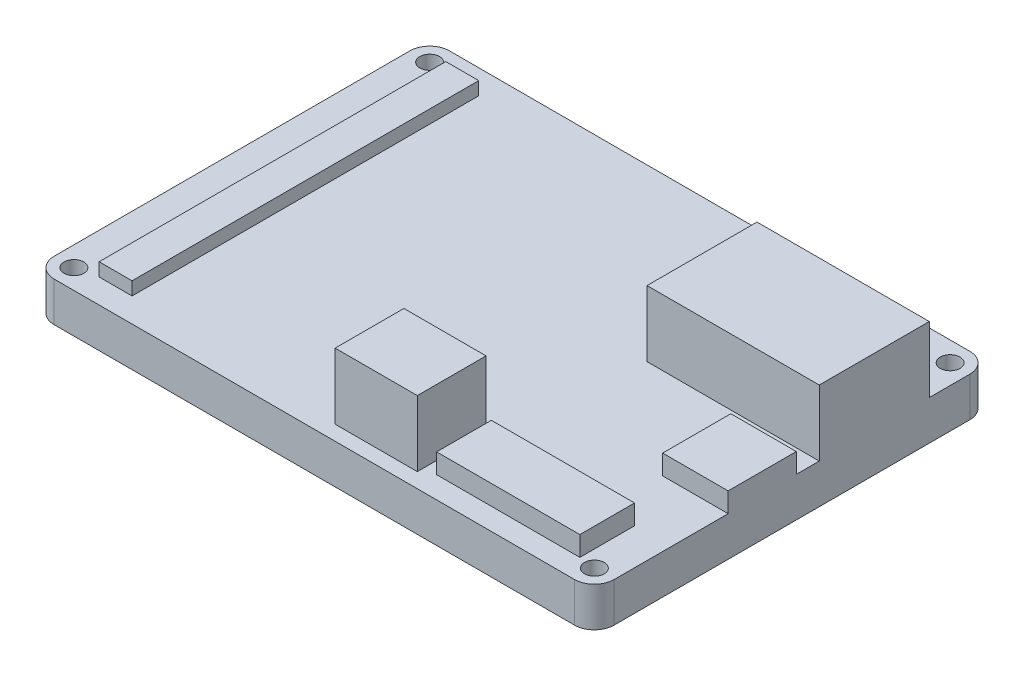
ISO-10303-21;
HEADER;
FILE_DESCRIPTION(('STEP AP214'),'2;1');
FILE_NAME('part.step','',(''),(''),'','','');
FILE_SCHEMA(('AUTOMOTIVE_DESIGN { 1 0 10303 214 1 1 1 1 }'));
ENDSEC;
DATA;
#1=APPLICATION_CONTEXT('core data for automotive mechanical design processes');
#2=APPLICATION_PROTOCOL_DEFINITION('international standard','automotive_design',2000,#1);
#3=PRODUCT_CONTEXT('',#1,'mechanical');
#4=PRODUCT('Part','Part','',(#3));
#5=PRODUCT_RELATED_PRODUCT_CATEGORY('part','',(#4));
#6=PRODUCT_DEFINITION_FORMATION('','',#4);
#7=PRODUCT_DEFINITION_CONTEXT('part definition',#1,'design');
#8=PRODUCT_DEFINITION('design','',#6,#7);
#9=PRODUCT_DEFINITION_SHAPE('','',#8);
#10=(LENGTH_UNIT() NAMED_UNIT(*) SI_UNIT(.MILLI.,.METRE.));
#11=(NAMED_UNIT(*) PLANE_ANGLE_UNIT() SI_UNIT($,.RADIAN.));
#12=(NAMED_UNIT(*) SI_UNIT($,.STERADIAN.) SOLID_ANGLE_UNIT());
#13=UNCERTAINTY_MEASURE_WITH_UNIT(LENGTH_MEASURE(1.E-05),#10,'distance_accuracy_value','');
#14=(GEOMETRIC_REPRESENTATION_CONTEXT(3) GLOBAL_UNCERTAINTY_ASSIGNED_CONTEXT((#13)) GLOBAL_UNIT_ASSIGNED_CONTEXT((#10,
#11,#12)) REPRESENTATION_CONTEXT('',''));
#15=CARTESIAN_POINT('',(0.,0.,0.));
#16=DIRECTION('',(0.,0.,1.));
#17=DIRECTION('',(1.,0.,0.));
#18=AXIS2_PLACEMENT_3D('',#15,#16,#17);
#19=CARTESIAN_POINT('',(-39.5,3.,27.));
#20=DIRECTION('',(0.,1.,0.));
#21=DIRECTION('',(0.,0.,1.));
#22=AXIS2_PLACEMENT_3D('',#19,#20,#21);
#23=PLANE('',#22);
#24=DIRECTION('',(1.,0.,0.));
#25=VECTOR('',#24,1.);
#26=CARTESIAN_POINT('',(-39.5,3.,17.3194018244587));
#27=LINE('',#26,#25);
#28=CARTESIAN_POINT('',(0.907460839729701,3.,17.3194018244587));
#29=VERTEX_POINT('',#28);
#30=CARTESIAN_POINT('',(13.3808844788232,3.,17.3194018244587));
#31=VERTEX_POINT('',#30);
#32=EDGE_CURVE('E447',#29,#31,#27,.T.);
#33=ORIENTED_EDGE('',*,*,#32,.T.);
#34=DIRECTION('',(0.,0.,1.));
#35=VECTOR('',#34,1.);
#36=CARTESIAN_POINT('',(13.3808844788232,3.,27.));
#37=LINE('',#36,#35);
#38=CARTESIAN_POINT('',(13.3808844788232,3.,27.7522059065731));
#39=VERTEX_POINT('',#38);
#40=EDGE_CURVE('E450',#31,#39,#37,.T.);
#41=ORIENTED_EDGE('',*,*,#40,.T.);
#42=DIRECTION('',(-1.,0.,0.));
#43=VECTOR('',#42,1.);
#44=CARTESIAN_POINT('',(-39.5,3.,27.7522059065731));
#45=LINE('',#44,#43);
#46=CARTESIAN_POINT('',(0.907460839729701,3.,27.7522059065731));
#47=VERTEX_POINT('',#46);
#48=EDGE_CURVE('E441',#39,#47,#45,.T.);
#49=ORIENTED_EDGE('',*,*,#48,.T.);
#50=DIRECTION('',(0.,0.,-1.));
#51=VECTOR('',#50,1.);
#52=CARTESIAN_POINT('',(0.907460839729701,3.,27.));
#53=LINE('',#52,#51);
#54=EDGE_CURVE('E444',#47,#29,#53,.T.);
#55=ORIENTED_EDGE('',*,*,#54,.T.);
#56=EDGE_LOOP('',(#33,#41,#49,#55));
#57=FACE_BOUND('',#56,.T.);
#58=CARTESIAN_POINT('',(-39.5,3.,27.));
#59=DIRECTION('',(0.,1.,0.));
#60=DIRECTION('',(0.,0.,1.));
#61=AXIS2_PLACEMENT_3D('',#58,#59,#60);
#62=CIRCLE('',#61,1.5);
#63=CARTESIAN_POINT('',(-39.5,3.,28.5));
#64=VERTEX_POINT('',#63);
#65=EDGE_CURVE('E332',#64,#64,#62,.T.);
#66=ORIENTED_EDGE('',*,*,#65,.F.);
#67=EDGE_LOOP('',(#66));
#68=FACE_BOUND('',#67,.T.);
#69=CARTESIAN_POINT('',(39.5,3.,-27.));
#70=DIRECTION('',(0.,1.,0.));
#71=DIRECTION('',(0.,0.,1.));
#72=AXIS2_PLACEMENT_3D('',#69,#70,#71);
#73=CIRCLE('',#72,1.5);
#74=CARTESIAN_POINT('',(39.5,3.,-25.5));
#75=VERTEX_POINT('',#74);
#76=EDGE_CURVE('E338',#75,#75,#73,.T.);
#77=ORIENTED_EDGE('',*,*,#76,.F.);
#78=EDGE_LOOP('',(#77));
#79=FACE_BOUND('',#78,.T.);
#80=CARTESIAN_POINT('',(-39.5,3.,-27.));
#81=DIRECTION('',(0.,1.,0.));
#82=DIRECTION('',(0.,0.,1.));
#83=AXIS2_PLACEMENT_3D('',#80,#81,#82);
#84=CIRCLE('',#83,1.5);
#85=CARTESIAN_POINT('',(-39.5,3.,-25.5));
#86=VERTEX_POINT('',#85);
#87=EDGE_CURVE('E341',#86,#86,#84,.T.);
#88=ORIENTED_EDGE('',*,*,#87,.F.);
#89=EDGE_LOOP('',(#88));
#90=FACE_BOUND('',#89,.T.);
#91=CARTESIAN_POINT('',(39.5,3.,27.));
#92=DIRECTION('',(0.,1.,0.));
#93=DIRECTION('',(0.,0.,1.));
#94=AXIS2_PLACEMENT_3D('',#91,#92,#93);
#95=CIRCLE('',#94,1.5);
#96=CARTESIAN_POINT('',(39.5,3.,28.5));
#97=VERTEX_POINT('',#96);
#98=EDGE_CURVE('E335',#97,#97,#95,.T.);
#99=ORIENTED_EDGE('',*,*,#98,.F.);
#100=EDGE_LOOP('',(#99));
#101=FACE_BOUND('',#100,.T.);
#102=DIRECTION('',(-1.,0.,0.));
#103=VECTOR('',#102,1.);
#104=CARTESIAN_POINT('',(-39.5,3.,26.3125821658206));
#105=LINE('',#104,#103);
#106=CARTESIAN_POINT('',(-31.3605184433164,3.,26.3125821658206));
#107=VERTEX_POINT('',#106);
#108=CARTESIAN_POINT('',(-36.3605184433164,3.,26.3125821658206));
#109=VERTEX_POINT('',#108);
#110=EDGE_CURVE('E429',#107,#109,#105,.T.);
#111=ORIENTED_EDGE('',*,*,#110,.T.);
#112=DIRECTION('',(0.,0.,-1.));
#113=VECTOR('',#112,1.);
#114=CARTESIAN_POINT('',(-36.3605184433164,3.,27.));
#115=LINE('',#114,#113);
#116=CARTESIAN_POINT('',(-36.3605184433164,3.,-26.3125821658206));
#117=VERTEX_POINT('',#116);
#118=EDGE_CURVE('E432',#109,#117,#115,.T.);
#119=ORIENTED_EDGE('',*,*,#118,.T.);
#120=DIRECTION('',(1.,0.,0.));
#121=VECTOR('',#120,1.);
#122=CARTESIAN_POINT('',(-39.5,3.,-26.3125821658206));
#123=LINE('',#122,#121);
#124=CARTESIAN_POINT('',(-31.3605184433164,3.,-26.3125821658206));
#125=VERTEX_POINT('',#124);
#126=EDGE_CURVE('E409',#117,#125,#123,.T.);
#127=ORIENTED_EDGE('',*,*,#126,.T.);
#128=DIRECTION('',(0.,0.,1.));
#129=VECTOR('',#128,1.);
#130=CARTESIAN_POINT('',(-31.3605184433164,3.,27.));
#131=LINE('',#130,#129);
#132=EDGE_CURVE('E426',#125,#107,#131,.T.);
#133=ORIENTED_EDGE('',*,*,#132,.T.);
#134=EDGE_LOOP('',(#111,#119,#127,#133));
#135=FACE_BOUND('',#134,.T.);
#136=DIRECTION('',(0.,0.,-1.));
#137=VECTOR('',#136,1.);
#138=CARTESIAN_POINT('',(32.5617137231515,3.,27.));
#139=LINE('',#138,#137);
#140=CARTESIAN_POINT('',(32.5617137231515,3.,9.69196109058796));
#141=VERTEX_POINT('',#140);
#142=CARTESIAN_POINT('',(32.5617137231515,3.,-0.652865755010733));
#143=VERTEX_POINT('',#142);
#144=EDGE_CURVE('E438',#141,#143,#139,.T.);
#145=ORIENTED_EDGE('',*,*,#144,.T.);
#146=DIRECTION('',(1.,0.,0.));
#147=VECTOR('',#146,1.);
#148=CARTESIAN_POINT('',(-39.5,3.,-0.652865755010734));
#149=LINE('',#148,#147);
#150=CARTESIAN_POINT('',(42.5,3.,-0.652865755010733));
#151=VERTEX_POINT('',#150);
#152=EDGE_CURVE('E284',#143,#151,#149,.T.);
#153=ORIENTED_EDGE('',*,*,#152,.T.);
#154=DIRECTION('',(0.,0.,-1.));
#155=VECTOR('',#154,1.);
#156=CARTESIAN_POINT('',(42.5,3.,27.));
#157=LINE('',#156,#155);
#158=CARTESIAN_POINT('',(42.5,3.,-4.14141677542409));
#159=VERTEX_POINT('',#158);
#160=EDGE_CURVE('E358',#151,#159,#157,.T.);
#161=ORIENTED_EDGE('',*,*,#160,.T.);
#162=DIRECTION('',(-1.,0.,0.));
#163=VECTOR('',#162,1.);
#164=CARTESIAN_POINT('',(-39.5,3.,-4.14141677542409));
#165=LINE('',#164,#163);
#166=CARTESIAN_POINT('',(16.3562918597164,3.,-4.14141677542409));
#167=VERTEX_POINT('',#166);
#168=EDGE_CURVE('E306',#159,#167,#165,.T.);
#169=ORIENTED_EDGE('',*,*,#168,.T.);
#170=DIRECTION('',(0.,0.,-1.));
#171=VECTOR('',#170,1.);
#172=CARTESIAN_POINT('',(16.3562918597164,3.,27.));
#173=LINE('',#172,#171);
#174=CARTESIAN_POINT('',(16.3562918597164,3.,-20.8379099531442));
#175=VERTEX_POINT('',#174);
#176=EDGE_CURVE('E435',#167,#175,#173,.T.);
#177=ORIENTED_EDGE('',*,*,#176,.T.);
#178=DIRECTION('',(1.,0.,0.));
#179=VECTOR('',#178,1.);
#180=CARTESIAN_POINT('',(-39.5,3.,-20.8379099531442));
#181=LINE('',#180,#179);
#182=CARTESIAN_POINT('',(42.5,3.,-20.8379099531442));
#183=VERTEX_POINT('',#182);
#184=EDGE_CURVE('E309',#175,#183,#181,.T.);
#185=ORIENTED_EDGE('',*,*,#184,.T.);
#186=CARTESIAN_POINT('',(42.5,3.,-27.));
#187=VERTEX_POINT('',#186);
#188=EDGE_CURVE('E353',#183,#187,#157,.T.);
#189=ORIENTED_EDGE('',*,*,#188,.T.);
#190=CARTESIAN_POINT('',(39.5,3.,-27.));
#191=DIRECTION('',(0.,1.,0.));
#192=DIRECTION('',(0.,0.,1.));
#193=AXIS2_PLACEMENT_3D('',#190,#191,#192);
#194=CIRCLE('',#193,3.);
#195=CARTESIAN_POINT('',(39.5,3.,-30.));
#196=VERTEX_POINT('',#195);
#197=EDGE_CURVE('E357',#187,#196,#194,.T.);
#198=ORIENTED_EDGE('',*,*,#197,.T.);
#199=DIRECTION('',(-1.,0.,0.));
#200=VECTOR('',#199,1.);
#201=CARTESIAN_POINT('',(-39.5,3.,-30.));
#202=LINE('',#201,#200);
#203=CARTESIAN_POINT('',(-39.5,3.,-30.));
#204=VERTEX_POINT('',#203);
#205=EDGE_CURVE('E361',#196,#204,#202,.T.);
#206=ORIENTED_EDGE('',*,*,#205,.T.);
#207=CARTESIAN_POINT('',(-39.5,3.,-27.));
#208=DIRECTION('',(0.,1.,0.));
#209=DIRECTION('',(0.,0.,1.));
#210=AXIS2_PLACEMENT_3D('',#207,#208,#209);
#211=CIRCLE('',#210,3.);
#212=CARTESIAN_POINT('',(-42.5,3.,-27.));
#213=VERTEX_POINT('',#212);
#214=EDGE_CURVE('E364',#204,#213,#211,.T.);
#215=ORIENTED_EDGE('',*,*,#214,.T.);
#216=DIRECTION('',(0.,0.,1.));
#217=VECTOR('',#216,1.);
#218=CARTESIAN_POINT('',(-42.5,3.,27.));
#219=LINE('',#218,#217);
#220=CARTESIAN_POINT('',(-42.5,3.,27.));
#221=VERTEX_POINT('',#220);
#222=EDGE_CURVE('E367',#213,#221,#219,.T.);
#223=ORIENTED_EDGE('',*,*,#222,.T.);
#224=CARTESIAN_POINT('',(-39.5,3.,27.));
#225=DIRECTION('',(0.,1.,0.));
#226=DIRECTION('',(0.,0.,1.));
#227=AXIS2_PLACEMENT_3D('',#224,#225,#226);
#228=CIRCLE('',#227,3.);
#229=CARTESIAN_POINT('',(-39.5,3.,30.));
#230=VERTEX_POINT('',#229);
#231=EDGE_CURVE('E344',#221,#230,#228,.T.);
#232=ORIENTED_EDGE('',*,*,#231,.T.);
#233=DIRECTION('',(1.,0.,0.));
#234=VECTOR('',#233,1.);
#235=CARTESIAN_POINT('',(-39.5,3.,30.));
#236=LINE('',#235,#234);
#237=CARTESIAN_POINT('',(39.5,3.,30.));
#238=VERTEX_POINT('',#237);
#239=EDGE_CURVE('E347',#230,#238,#236,.T.);
#240=ORIENTED_EDGE('',*,*,#239,.T.);
#241=CARTESIAN_POINT('',(39.5,3.,27.));
#242=DIRECTION('',(0.,1.,0.));
#243=DIRECTION('',(0.,0.,-1.));
#244=AXIS2_PLACEMENT_3D('',#241,#242,#243);
#245=CIRCLE('',#244,3.);
#246=CARTESIAN_POINT('',(42.5,3.,27.));
#247=VERTEX_POINT('',#246);
#248=EDGE_CURVE('E350',#238,#247,#245,.T.);
#249=ORIENTED_EDGE('',*,*,#248,.T.);
#250=CARTESIAN_POINT('',(42.5,3.,9.69196109058796));
#251=VERTEX_POINT('',#250);
#252=EDGE_CURVE('E354',#247,#251,#157,.T.);
#253=ORIENTED_EDGE('',*,*,#252,.T.);
#254=DIRECTION('',(-1.,0.,0.));
#255=VECTOR('',#254,1.);
#256=CARTESIAN_POINT('',(-39.5,3.,9.69196109058796));
#257=LINE('',#256,#255);
#258=EDGE_CURVE('E281',#251,#141,#257,.T.);
#259=ORIENTED_EDGE('',*,*,#258,.T.);
#260=EDGE_LOOP('',(#145,#153,#161,#169,#177,#185,#189,#198,#206,#215,#223,#232,#240,#249,#253,#259));
#261=FACE_BOUND('',#260,.T.);
#262=DIRECTION('',(1.,0.,0.));
#263=VECTOR('',#262,1.);
#264=CARTESIAN_POINT('',(-39.5,3.,18.3864769387583));
#265=LINE('',#264,#263);
#266=CARTESIAN_POINT('',(15.2481871083836,3.,18.3864769387583));
#267=VERTEX_POINT('',#266);
#268=CARTESIAN_POINT('',(36.9873404475385,3.,18.3864769387583));
#269=VERTEX_POINT('',#268);
#270=EDGE_CURVE('E39',#267,#269,#265,.T.);
#271=ORIENTED_EDGE('',*,*,#270,.T.);
#272=DIRECTION('',(0.,0.,1.));
#273=VECTOR('',#272,1.);
#274=CARTESIAN_POINT('',(36.9873404475385,3.,27.));
#275=LINE('',#274,#273);
#276=CARTESIAN_POINT('',(36.9873404475385,3.,26.6879137591047));
#277=VERTEX_POINT('',#276);
#278=EDGE_CURVE('E11',#269,#277,#275,.T.);
#279=ORIENTED_EDGE('',*,*,#278,.T.);
#280=DIRECTION('',(-1.,0.,0.));
#281=VECTOR('',#280,1.);
#282=CARTESIAN_POINT('',(-39.5,3.,26.6879137591047));
#283=LINE('',#282,#281);
#284=CARTESIAN_POINT('',(15.2481871083836,3.,26.6879137591047));
#285=VERTEX_POINT('',#284);
#286=EDGE_CURVE('E453',#277,#285,#283,.T.);
#287=ORIENTED_EDGE('',*,*,#286,.T.);
#288=DIRECTION('',(0.,0.,-1.));
#289=VECTOR('',#288,1.);
#290=CARTESIAN_POINT('',(15.2481871083836,3.,27.));
#291=LINE('',#290,#289);
#292=EDGE_CURVE('E456',#285,#267,#291,.T.);
#293=ORIENTED_EDGE('',*,*,#292,.T.);
#294=EDGE_LOOP('',(#271,#279,#287,#293));
#295=FACE_BOUND('',#294,.T.);
#296=ADVANCED_FACE('F31',(#57,#68,#79,#90,#101,#135,#261,#295),#23,.T.);
#297=CARTESIAN_POINT('',(-39.5,-3.,27.));
#298=DIRECTION('',(0.,1.,0.));
#299=DIRECTION('',(0.,0.,1.));
#300=AXIS2_PLACEMENT_3D('',#297,#298,#299);
#301=CYLINDRICAL_SURFACE('',#300,3.);
#302=DIRECTION('',(0.,1.,0.));
#303=VECTOR('',#302,1.);
#304=CARTESIAN_POINT('',(-39.5,-3.,30.));
#305=LINE('',#304,#303);
#306=CARTESIAN_POINT('',(-39.5,-3.,30.));
#307=VERTEX_POINT('',#306);
#308=EDGE_CURVE('E406',#307,#230,#305,.T.);
#309=ORIENTED_EDGE('',*,*,#308,.T.);
#310=ORIENTED_EDGE('',*,*,#231,.F.);
#311=DIRECTION('',(0.,1.,0.));
#312=VECTOR('',#311,1.);
#313=CARTESIAN_POINT('',(-42.5,-3.,27.));
#314=LINE('',#313,#312);
#315=CARTESIAN_POINT('',(-42.5,-3.,27.));
#316=VERTEX_POINT('',#315);
#317=EDGE_CURVE('E407',#316,#221,#314,.T.);
#318=ORIENTED_EDGE('',*,*,#317,.F.);
#319=CARTESIAN_POINT('',(-39.5,-3.,27.));
#320=DIRECTION('',(0.,1.,0.));
#321=DIRECTION('',(0.,0.,1.));
#322=AXIS2_PLACEMENT_3D('',#319,#320,#321);
#323=CIRCLE('',#322,3.);
#324=EDGE_CURVE('E382',#316,#307,#323,.T.);
#325=ORIENTED_EDGE('',*,*,#324,.T.);
#326=EDGE_LOOP('',(#309,#310,#318,#325));
#327=FACE_BOUND('',#326,.T.);
#328=ADVANCED_FACE('F33',(#327),#301,.T.);
#329=CARTESIAN_POINT('',(-42.5,-3.,27.));
#330=DIRECTION('',(-1.,0.,0.));
#331=DIRECTION('',(0.,0.,1.));
#332=AXIS2_PLACEMENT_3D('',#329,#330,#331);
#333=PLANE('',#332);
#334=ORIENTED_EDGE('',*,*,#317,.T.);
#335=ORIENTED_EDGE('',*,*,#222,.F.);
#336=DIRECTION('',(0.,1.,0.));
#337=VECTOR('',#336,1.);
#338=CARTESIAN_POINT('',(-42.5,-3.,-27.));
#339=LINE('',#338,#337);
#340=CARTESIAN_POINT('',(-42.5,-3.,-27.));
#341=VERTEX_POINT('',#340);
#342=EDGE_CURVE('E410',#341,#213,#339,.T.);
#343=ORIENTED_EDGE('',*,*,#342,.F.);
#344=DIRECTION('',(0.,0.,1.));
#345=VECTOR('',#344,1.);
#346=CARTESIAN_POINT('',(-42.5,-3.,27.));
#347=LINE('',#346,#345);
#348=EDGE_CURVE('E403',#341,#316,#347,.T.);
#349=ORIENTED_EDGE('',*,*,#348,.T.);
#350=EDGE_LOOP('',(#334,#335,#343,#349));
#351=FACE_BOUND('',#350,.T.);
#352=ADVANCED_FACE('F480',(#351),#333,.T.);
#353=CARTESIAN_POINT('',(-39.5,-3.,-27.));
#354=DIRECTION('',(0.,1.,0.));
#355=DIRECTION('',(0.,0.,1.));
#356=AXIS2_PLACEMENT_3D('',#353,#354,#355);
#357=CYLINDRICAL_SURFACE('',#356,3.);
#358=ORIENTED_EDGE('',*,*,#342,.T.);
#359=ORIENTED_EDGE('',*,*,#214,.F.);
#360=DIRECTION('',(0.,1.,0.));
#361=VECTOR('',#360,1.);
#362=CARTESIAN_POINT('',(-39.5,-3.,-30.));
#363=LINE('',#362,#361);
#364=CARTESIAN_POINT('',(-39.5,-3.,-30.));
#365=VERTEX_POINT('',#364);
#366=EDGE_CURVE('E412',#365,#204,#363,.T.);
#367=ORIENTED_EDGE('',*,*,#366,.F.);
#368=CARTESIAN_POINT('',(-39.5,-3.,-27.));
#369=DIRECTION('',(0.,1.,0.));
#370=DIRECTION('',(0.,0.,1.));
#371=AXIS2_PLACEMENT_3D('',#368,#369,#370);
#372=CIRCLE('',#371,3.);
#373=EDGE_CURVE('E400',#365,#341,#372,.T.);
#374=ORIENTED_EDGE('',*,*,#373,.T.);
#375=EDGE_LOOP('',(#358,#359,#367,#374));
#376=FACE_BOUND('',#375,.T.);
#377=ADVANCED_FACE('F510',(#376),#357,.T.);
#378=CARTESIAN_POINT('',(-39.5,-3.,-30.));
#379=DIRECTION('',(0.,0.,-1.));
#380=DIRECTION('',(-1.,0.,0.));
#381=AXIS2_PLACEMENT_3D('',#378,#379,#380);
#382=PLANE('',#381);
#383=ORIENTED_EDGE('',*,*,#366,.T.);
#384=ORIENTED_EDGE('',*,*,#205,.F.);
#385=DIRECTION('',(0.,1.,0.));
#386=VECTOR('',#385,1.);
#387=CARTESIAN_POINT('',(39.5,-3.,-30.));
#388=LINE('',#387,#386);
#389=CARTESIAN_POINT('',(39.5,-3.,-30.));
#390=VERTEX_POINT('',#389);
#391=EDGE_CURVE('E414',#390,#196,#388,.T.);
#392=ORIENTED_EDGE('',*,*,#391,.F.);
#393=DIRECTION('',(-1.,0.,0.));
#394=VECTOR('',#393,1.);
#395=CARTESIAN_POINT('',(-39.5,-3.,-30.));
#396=LINE('',#395,#394);
#397=EDGE_CURVE('E397',#390,#365,#396,.T.);
#398=ORIENTED_EDGE('',*,*,#397,.T.);
#399=EDGE_LOOP('',(#383,#384,#392,#398));
#400=FACE_BOUND('',#399,.T.);
#401=ADVANCED_FACE('F514',(#400),#382,.T.);
#402=CARTESIAN_POINT('',(39.5,-3.,-27.));
#403=DIRECTION('',(0.,1.,0.));
#404=DIRECTION('',(0.,0.,1.));
#405=AXIS2_PLACEMENT_3D('',#402,#403,#404);
#406=CYLINDRICAL_SURFACE('',#405,3.);
#407=ORIENTED_EDGE('',*,*,#391,.T.);
#408=ORIENTED_EDGE('',*,*,#197,.F.);
#409=DIRECTION('',(0.,1.,0.));
#410=VECTOR('',#409,1.);
#411=CARTESIAN_POINT('',(42.5,-3.,-27.));
#412=LINE('',#411,#410);
#413=CARTESIAN_POINT('',(42.5,-3.,-27.));
#414=VERTEX_POINT('',#413);
#415=EDGE_CURVE('E416',#414,#187,#412,.T.);
#416=ORIENTED_EDGE('',*,*,#415,.F.);
#417=CARTESIAN_POINT('',(39.5,-3.,-27.));
#418=DIRECTION('',(0.,1.,0.));
#419=DIRECTION('',(0.,0.,1.));
#420=AXIS2_PLACEMENT_3D('',#417,#418,#419);
#421=CIRCLE('',#420,3.);
#422=EDGE_CURVE('E394',#414,#390,#421,.T.);
#423=ORIENTED_EDGE('',*,*,#422,.T.);
#424=EDGE_LOOP('',(#407,#408,#416,#423));
#425=FACE_BOUND('',#424,.T.);
#426=ADVANCED_FACE('F518',(#425),#406,.T.);
#427=CARTESIAN_POINT('',(42.5,-3.,27.));
#428=DIRECTION('',(1.,0.,0.));
#429=DIRECTION('',(0.,0.,-1.));
#430=AXIS2_PLACEMENT_3D('',#427,#428,#429);
#431=PLANE('',#430);
#432=ORIENTED_EDGE('',*,*,#160,.F.);
#433=DIRECTION('',(0.,-1.,0.));
#434=VECTOR('',#433,1.);
#435=CARTESIAN_POINT('',(42.5,6.,-0.652865755010733));
#436=LINE('',#435,#434);
#437=CARTESIAN_POINT('',(42.5,6.,-0.652865755010733));
#438=VERTEX_POINT('',#437);
#439=EDGE_CURVE('E279',#438,#151,#436,.T.);
#440=ORIENTED_EDGE('',*,*,#439,.F.);
#441=DIRECTION('',(0.,0.,-1.));
#442=VECTOR('',#441,1.);
#443=CARTESIAN_POINT('',(42.5,6.,9.69196109058796));
#444=LINE('',#443,#442);
#445=CARTESIAN_POINT('',(42.5,6.,9.69196109058796));
#446=VERTEX_POINT('',#445);
#447=EDGE_CURVE('E262',#446,#438,#444,.T.);
#448=ORIENTED_EDGE('',*,*,#447,.F.);
#449=DIRECTION('',(0.,-1.,0.));
#450=VECTOR('',#449,1.);
#451=CARTESIAN_POINT('',(42.5,6.,9.69196109058796));
#452=LINE('',#451,#450);
#453=EDGE_CURVE('E271',#446,#251,#452,.T.);
#454=ORIENTED_EDGE('',*,*,#453,.T.);
#455=ORIENTED_EDGE('',*,*,#252,.F.);
#456=DIRECTION('',(0.,1.,0.));
#457=VECTOR('',#456,1.);
#458=CARTESIAN_POINT('',(42.5,-3.,27.));
#459=LINE('',#458,#457);
#460=CARTESIAN_POINT('',(42.5,-3.,27.));
#461=VERTEX_POINT('',#460);
#462=EDGE_CURVE('E419',#461,#247,#459,.T.);
#463=ORIENTED_EDGE('',*,*,#462,.F.);
#464=DIRECTION('',(0.,0.,-1.));
#465=VECTOR('',#464,1.);
#466=CARTESIAN_POINT('',(42.5,-3.,27.));
#467=LINE('',#466,#465);
#468=EDGE_CURVE('E391',#461,#414,#467,.T.);
#469=ORIENTED_EDGE('',*,*,#468,.T.);
#470=ORIENTED_EDGE('',*,*,#415,.T.);
#471=ORIENTED_EDGE('',*,*,#188,.F.);
#472=DIRECTION('',(0.,-1.,0.));
#473=VECTOR('',#472,1.);
#474=CARTESIAN_POINT('',(42.5,13.,-20.8379099531442));
#475=LINE('',#474,#473);
#476=CARTESIAN_POINT('',(42.5,13.,-20.8379099531442));
#477=VERTEX_POINT('',#476);
#478=EDGE_CURVE('E304',#477,#183,#475,.T.);
#479=ORIENTED_EDGE('',*,*,#478,.F.);
#480=DIRECTION('',(0.,0.,-1.));
#481=VECTOR('',#480,1.);
#482=CARTESIAN_POINT('',(42.5,13.,-4.14141677542409));
#483=LINE('',#482,#481);
#484=CARTESIAN_POINT('',(42.5,13.,-4.14141677542409));
#485=VERTEX_POINT('',#484);
#486=EDGE_CURVE('E287',#485,#477,#483,.T.);
#487=ORIENTED_EDGE('',*,*,#486,.F.);
#488=DIRECTION('',(0.,-1.,0.));
#489=VECTOR('',#488,1.);
#490=CARTESIAN_POINT('',(42.5,13.,-4.14141677542409));
#491=LINE('',#490,#489);
#492=EDGE_CURVE('E296',#485,#159,#491,.T.);
#493=ORIENTED_EDGE('',*,*,#492,.T.);
#494=EDGE_LOOP('',(#432,#440,#448,#454,#455,#463,#469,#470,#471,#479,#487,#493));
#495=FACE_BOUND('',#494,.T.);
#496=ADVANCED_FACE('F522',(#495),#431,.T.);
#497=CARTESIAN_POINT('',(39.5,-3.,27.));
#498=DIRECTION('',(0.,1.,0.));
#499=DIRECTION('',(0.,0.,1.));
#500=AXIS2_PLACEMENT_3D('',#497,#498,#499);
#501=CYLINDRICAL_SURFACE('',#500,3.);
#502=ORIENTED_EDGE('',*,*,#462,.T.);
#503=ORIENTED_EDGE('',*,*,#248,.F.);
#504=DIRECTION('',(0.,1.,0.));
#505=VECTOR('',#504,1.);
#506=CARTESIAN_POINT('',(39.5,-3.,30.));
#507=LINE('',#506,#505);
#508=CARTESIAN_POINT('',(39.5,-3.,30.));
#509=VERTEX_POINT('',#508);
#510=EDGE_CURVE('E421',#509,#238,#507,.T.);
#511=ORIENTED_EDGE('',*,*,#510,.F.);
#512=CARTESIAN_POINT('',(39.5,-3.,27.));
#513=DIRECTION('',(0.,1.,0.));
#514=DIRECTION('',(0.,0.,-1.));
#515=AXIS2_PLACEMENT_3D('',#512,#513,#514);
#516=CIRCLE('',#515,3.);
#517=EDGE_CURVE('E388',#509,#461,#516,.T.);
#518=ORIENTED_EDGE('',*,*,#517,.T.);
#519=EDGE_LOOP('',(#502,#503,#511,#518));
#520=FACE_BOUND('',#519,.T.);
#521=ADVANCED_FACE('F526',(#520),#501,.T.);
#522=CARTESIAN_POINT('',(-39.5,-3.,30.));
#523=DIRECTION('',(0.,0.,1.));
#524=DIRECTION('',(1.,0.,0.));
#525=AXIS2_PLACEMENT_3D('',#522,#523,#524);
#526=PLANE('',#525);
#527=ORIENTED_EDGE('',*,*,#510,.T.);
#528=ORIENTED_EDGE('',*,*,#239,.F.);
#529=ORIENTED_EDGE('',*,*,#308,.F.);
#530=DIRECTION('',(1.,0.,0.));
#531=VECTOR('',#530,1.);
#532=CARTESIAN_POINT('',(-39.5,-3.,30.));
#533=LINE('',#532,#531);
#534=EDGE_CURVE('E385',#307,#509,#533,.T.);
#535=ORIENTED_EDGE('',*,*,#534,.T.);
#536=EDGE_LOOP('',(#527,#528,#529,#535));
#537=FACE_BOUND('',#536,.T.);
#538=ADVANCED_FACE('F506',(#537),#526,.T.);
#539=CARTESIAN_POINT('',(-39.5,-3.,27.));
#540=DIRECTION('',(0.,1.,0.));
#541=DIRECTION('',(0.,0.,1.));
#542=AXIS2_PLACEMENT_3D('',#539,#540,#541);
#543=PLANE('',#542);
#544=CARTESIAN_POINT('',(-39.5,-3.,27.));
#545=DIRECTION('',(0.,1.,0.));
#546=DIRECTION('',(0.,0.,1.));
#547=AXIS2_PLACEMENT_3D('',#544,#545,#546);
#548=CIRCLE('',#547,1.5);
#549=CARTESIAN_POINT('',(-39.5,-3.,28.5));
#550=VERTEX_POINT('',#549);
#551=EDGE_CURVE('E370',#550,#550,#548,.T.);
#552=ORIENTED_EDGE('',*,*,#551,.T.);
#553=EDGE_LOOP('',(#552));
#554=FACE_BOUND('',#553,.T.);
#555=CARTESIAN_POINT('',(39.5,-3.,27.));
#556=DIRECTION('',(0.,1.,0.));
#557=DIRECTION('',(0.,0.,1.));
#558=AXIS2_PLACEMENT_3D('',#555,#556,#557);
#559=CIRCLE('',#558,1.5);
#560=CARTESIAN_POINT('',(39.5,-3.,28.5));
#561=VERTEX_POINT('',#560);
#562=EDGE_CURVE('E373',#561,#561,#559,.T.);
#563=ORIENTED_EDGE('',*,*,#562,.T.);
#564=EDGE_LOOP('',(#563));
#565=FACE_BOUND('',#564,.T.);
#566=CARTESIAN_POINT('',(39.5,-3.,-27.));
#567=DIRECTION('',(0.,1.,0.));
#568=DIRECTION('',(0.,0.,1.));
#569=AXIS2_PLACEMENT_3D('',#566,#567,#568);
#570=CIRCLE('',#569,1.5);
#571=CARTESIAN_POINT('',(39.5,-3.,-25.5));
#572=VERTEX_POINT('',#571);
#573=EDGE_CURVE('E376',#572,#572,#570,.T.);
#574=ORIENTED_EDGE('',*,*,#573,.T.);
#575=EDGE_LOOP('',(#574));
#576=FACE_BOUND('',#575,.T.);
#577=CARTESIAN_POINT('',(-39.5,-3.,-27.));
#578=DIRECTION('',(0.,1.,0.));
#579=DIRECTION('',(0.,0.,1.));
#580=AXIS2_PLACEMENT_3D('',#577,#578,#579);
#581=CIRCLE('',#580,1.5);
#582=CARTESIAN_POINT('',(-39.5,-3.,-25.5));
#583=VERTEX_POINT('',#582);
#584=EDGE_CURVE('E379',#583,#583,#581,.T.);
#585=ORIENTED_EDGE('',*,*,#584,.T.);
#586=EDGE_LOOP('',(#585));
#587=FACE_BOUND('',#586,.T.);
#588=ORIENTED_EDGE('',*,*,#324,.F.);
#589=ORIENTED_EDGE('',*,*,#348,.F.);
#590=ORIENTED_EDGE('',*,*,#373,.F.);
#591=ORIENTED_EDGE('',*,*,#397,.F.);
#592=ORIENTED_EDGE('',*,*,#422,.F.);
#593=ORIENTED_EDGE('',*,*,#468,.F.);
#594=ORIENTED_EDGE('',*,*,#517,.F.);
#595=ORIENTED_EDGE('',*,*,#534,.F.);
#596=EDGE_LOOP('',(#588,#589,#590,#591,#592,#593,#594,#595));
#597=FACE_BOUND('',#596,.T.);
#598=ADVANCED_FACE('F502',(#554,#565,#576,#587,#597),#543,.F.);
#599=CARTESIAN_POINT('',(-39.5,-3.,-27.));
#600=DIRECTION('',(0.,1.,0.));
#601=DIRECTION('',(0.,0.,1.));
#602=AXIS2_PLACEMENT_3D('',#599,#600,#601);
#603=CYLINDRICAL_SURFACE('',#602,1.5);
#604=ORIENTED_EDGE('',*,*,#584,.F.);
#605=EDGE_LOOP('',(#604));
#606=FACE_BOUND('',#605,.T.);
#607=ORIENTED_EDGE('',*,*,#87,.T.);
#608=EDGE_LOOP('',(#607));
#609=FACE_BOUND('',#608,.T.);
#610=ADVANCED_FACE('F498',(#606,#609),#603,.F.);
#611=CARTESIAN_POINT('',(39.5,-3.,-27.));
#612=DIRECTION('',(0.,1.,0.));
#613=DIRECTION('',(0.,0.,1.));
#614=AXIS2_PLACEMENT_3D('',#611,#612,#613);
#615=CYLINDRICAL_SURFACE('',#614,1.5);
#616=ORIENTED_EDGE('',*,*,#573,.F.);
#617=EDGE_LOOP('',(#616));
#618=FACE_BOUND('',#617,.T.);
#619=ORIENTED_EDGE('',*,*,#76,.T.);
#620=EDGE_LOOP('',(#619));
#621=FACE_BOUND('',#620,.T.);
#622=ADVANCED_FACE('F494',(#618,#621),#615,.F.);
#623=CARTESIAN_POINT('',(39.5,-3.,27.));
#624=DIRECTION('',(0.,1.,0.));
#625=DIRECTION('',(0.,0.,1.));
#626=AXIS2_PLACEMENT_3D('',#623,#624,#625);
#627=CYLINDRICAL_SURFACE('',#626,1.5);
#628=ORIENTED_EDGE('',*,*,#562,.F.);
#629=EDGE_LOOP('',(#628));
#630=FACE_BOUND('',#629,.T.);
#631=ORIENTED_EDGE('',*,*,#98,.T.);
#632=EDGE_LOOP('',(#631));
#633=FACE_BOUND('',#632,.T.);
#634=ADVANCED_FACE('F490',(#630,#633),#627,.F.);
#635=CARTESIAN_POINT('',(-39.5,-3.,27.));
#636=DIRECTION('',(0.,1.,0.));
#637=DIRECTION('',(0.,0.,1.));
#638=AXIS2_PLACEMENT_3D('',#635,#636,#637);
#639=CYLINDRICAL_SURFACE('',#638,1.5);
#640=ORIENTED_EDGE('',*,*,#551,.F.);
#641=EDGE_LOOP('',(#640));
#642=FACE_BOUND('',#641,.T.);
#643=ORIENTED_EDGE('',*,*,#65,.T.);
#644=EDGE_LOOP('',(#643));
#645=FACE_BOUND('',#644,.T.);
#646=ADVANCED_FACE('F487',(#642,#645),#639,.F.);
#647=CARTESIAN_POINT('',(-36.3605184433164,5.,26.3125821658206));
#648=DIRECTION('',(1.,0.,0.));
#649=DIRECTION('',(0.,0.,-1.));
#650=AXIS2_PLACEMENT_3D('',#647,#648,#649);
#651=PLANE('',#650);
#652=ORIENTED_EDGE('',*,*,#118,.F.);
#653=DIRECTION('',(0.,-1.,0.));
#654=VECTOR('',#653,1.);
#655=CARTESIAN_POINT('',(-36.3605184433164,5.,26.3125821658206));
#656=LINE('',#655,#654);
#657=CARTESIAN_POINT('',(-36.3605184433164,5.,26.3125821658206));
#658=VERTEX_POINT('',#657);
#659=EDGE_CURVE('E329',#658,#109,#656,.T.);
#660=ORIENTED_EDGE('',*,*,#659,.F.);
#661=DIRECTION('',(0.,0.,1.));
#662=VECTOR('',#661,1.);
#663=CARTESIAN_POINT('',(-36.3605184433164,5.,26.3125821658206));
#664=LINE('',#663,#662);
#665=CARTESIAN_POINT('',(-36.3605184433164,5.,-26.3125821658206));
#666=VERTEX_POINT('',#665);
#667=EDGE_CURVE('E312',#666,#658,#664,.T.);
#668=ORIENTED_EDGE('',*,*,#667,.F.);
#669=DIRECTION('',(0.,-1.,0.));
#670=VECTOR('',#669,1.);
#671=CARTESIAN_POINT('',(-36.3605184433164,5.,-26.3125821658206));
#672=LINE('',#671,#670);
#673=EDGE_CURVE('E321',#666,#117,#672,.T.);
#674=ORIENTED_EDGE('',*,*,#673,.T.);
#675=EDGE_LOOP('',(#652,#660,#668,#674));
#676=FACE_BOUND('',#675,.T.);
#677=ADVANCED_FACE('F485',(#676),#651,.F.);
#678=CARTESIAN_POINT('',(-31.3605184433164,5.,26.3125821658206));
#679=DIRECTION('',(0.,0.,-1.));
#680=DIRECTION('',(-1.,0.,0.));
#681=AXIS2_PLACEMENT_3D('',#678,#679,#680);
#682=PLANE('',#681);
#683=ORIENTED_EDGE('',*,*,#110,.F.);
#684=DIRECTION('',(0.,-1.,0.));
#685=VECTOR('',#684,1.);
#686=CARTESIAN_POINT('',(-31.3605184433164,5.,26.3125821658206));
#687=LINE('',#686,#685);
#688=CARTESIAN_POINT('',(-31.3605184433164,5.,26.3125821658206));
#689=VERTEX_POINT('',#688);
#690=EDGE_CURVE('E326',#689,#107,#687,.T.);
#691=ORIENTED_EDGE('',*,*,#690,.F.);
#692=DIRECTION('',(1.,0.,0.));
#693=VECTOR('',#692,1.);
#694=CARTESIAN_POINT('',(-31.3605184433164,5.,26.3125821658206));
#695=LINE('',#694,#693);
#696=EDGE_CURVE('E315',#658,#689,#695,.T.);
#697=ORIENTED_EDGE('',*,*,#696,.F.);
#698=ORIENTED_EDGE('',*,*,#659,.T.);
#699=EDGE_LOOP('',(#683,#691,#697,#698));
#700=FACE_BOUND('',#699,.T.);
#701=ADVANCED_FACE('F586',(#700),#682,.F.);
#702=CARTESIAN_POINT('',(-31.3605184433164,5.,26.3125821658206));
#703=DIRECTION('',(-1.,0.,0.));
#704=DIRECTION('',(0.,0.,1.));
#705=AXIS2_PLACEMENT_3D('',#702,#703,#704);
#706=PLANE('',#705);
#707=ORIENTED_EDGE('',*,*,#132,.F.);
#708=DIRECTION('',(0.,-1.,0.));
#709=VECTOR('',#708,1.);
#710=CARTESIAN_POINT('',(-31.3605184433164,5.,-26.3125821658206));
#711=LINE('',#710,#709);
#712=CARTESIAN_POINT('',(-31.3605184433164,5.,-26.3125821658206));
#713=VERTEX_POINT('',#712);
#714=EDGE_CURVE('E324',#713,#125,#711,.T.);
#715=ORIENTED_EDGE('',*,*,#714,.F.);
#716=DIRECTION('',(0.,0.,-1.));
#717=VECTOR('',#716,1.);
#718=CARTESIAN_POINT('',(-31.3605184433164,5.,26.3125821658206));
#719=LINE('',#718,#717);
#720=EDGE_CURVE('E317',#689,#713,#719,.T.);
#721=ORIENTED_EDGE('',*,*,#720,.F.);
#722=ORIENTED_EDGE('',*,*,#690,.T.);
#723=EDGE_LOOP('',(#707,#715,#721,#722));
#724=FACE_BOUND('',#723,.T.);
#725=ADVANCED_FACE('F583',(#724),#706,.F.);
#726=CARTESIAN_POINT('',(-31.3605184433164,5.,-26.3125821658206));
#727=DIRECTION('',(0.,0.,1.));
#728=DIRECTION('',(1.,0.,0.));
#729=AXIS2_PLACEMENT_3D('',#726,#727,#728);
#730=PLANE('',#729);
#731=ORIENTED_EDGE('',*,*,#126,.F.);
#732=ORIENTED_EDGE('',*,*,#673,.F.);
#733=DIRECTION('',(-1.,0.,0.));
#734=VECTOR('',#733,1.);
#735=CARTESIAN_POINT('',(-31.3605184433164,5.,-26.3125821658206));
#736=LINE('',#735,#734);
#737=EDGE_CURVE('E319',#713,#666,#736,.T.);
#738=ORIENTED_EDGE('',*,*,#737,.F.);
#739=ORIENTED_EDGE('',*,*,#714,.T.);
#740=EDGE_LOOP('',(#731,#732,#738,#739));
#741=FACE_BOUND('',#740,.T.);
#742=ADVANCED_FACE('F576',(#741),#730,.F.);
#743=CARTESIAN_POINT('',(-36.3605184433164,5.,-26.3125821658206));
#744=DIRECTION('',(0.,1.,0.));
#745=DIRECTION('',(0.,0.,1.));
#746=AXIS2_PLACEMENT_3D('',#743,#744,#745);
#747=PLANE('',#746);
#748=ORIENTED_EDGE('',*,*,#667,.T.);
#749=ORIENTED_EDGE('',*,*,#696,.T.);
#750=ORIENTED_EDGE('',*,*,#720,.T.);
#751=ORIENTED_EDGE('',*,*,#737,.T.);
#752=EDGE_LOOP('',(#748,#749,#750,#751));
#753=FACE_BOUND('',#752,.T.);
#754=ADVANCED_FACE('F569',(#753),#747,.T.);
#755=CARTESIAN_POINT('',(16.3562918597164,13.,-20.8379099531442));
#756=DIRECTION('',(0.,0.,1.));
#757=DIRECTION('',(1.,0.,0.));
#758=AXIS2_PLACEMENT_3D('',#755,#756,#757);
#759=PLANE('',#758);
#760=ORIENTED_EDGE('',*,*,#184,.F.);
#761=DIRECTION('',(0.,-1.,0.));
#762=VECTOR('',#761,1.);
#763=CARTESIAN_POINT('',(16.3562918597164,13.,-20.8379099531442));
#764=LINE('',#763,#762);
#765=CARTESIAN_POINT('',(16.3562918597164,13.,-20.8379099531442));
#766=VERTEX_POINT('',#765);
#767=EDGE_CURVE('E301',#766,#175,#764,.T.);
#768=ORIENTED_EDGE('',*,*,#767,.F.);
#769=DIRECTION('',(-1.,0.,0.));
#770=VECTOR('',#769,1.);
#771=CARTESIAN_POINT('',(16.3562918597164,13.,-20.8379099531442));
#772=LINE('',#771,#770);
#773=EDGE_CURVE('E290',#477,#766,#772,.T.);
#774=ORIENTED_EDGE('',*,*,#773,.F.);
#775=ORIENTED_EDGE('',*,*,#478,.T.);
#776=EDGE_LOOP('',(#760,#768,#774,#775));
#777=FACE_BOUND('',#776,.T.);
#778=ADVANCED_FACE('F567',(#777),#759,.F.);
#779=CARTESIAN_POINT('',(16.3562918597164,13.,-4.14141677542409));
#780=DIRECTION('',(1.,0.,0.));
#781=DIRECTION('',(0.,0.,-1.));
#782=AXIS2_PLACEMENT_3D('',#779,#780,#781);
#783=PLANE('',#782);
#784=ORIENTED_EDGE('',*,*,#176,.F.);
#785=DIRECTION('',(0.,-1.,0.));
#786=VECTOR('',#785,1.);
#787=CARTESIAN_POINT('',(16.3562918597164,13.,-4.14141677542409));
#788=LINE('',#787,#786);
#789=CARTESIAN_POINT('',(16.3562918597164,13.,-4.14141677542409));
#790=VERTEX_POINT('',#789);
#791=EDGE_CURVE('E299',#790,#167,#788,.T.);
#792=ORIENTED_EDGE('',*,*,#791,.F.);
#793=DIRECTION('',(0.,0.,1.));
#794=VECTOR('',#793,1.);
#795=CARTESIAN_POINT('',(16.3562918597164,13.,-4.14141677542409));
#796=LINE('',#795,#794);
#797=EDGE_CURVE('E292',#766,#790,#796,.T.);
#798=ORIENTED_EDGE('',*,*,#797,.F.);
#799=ORIENTED_EDGE('',*,*,#767,.T.);
#800=EDGE_LOOP('',(#784,#792,#798,#799));
#801=FACE_BOUND('',#800,.T.);
#802=ADVANCED_FACE('F565',(#801),#783,.F.);
#803=CARTESIAN_POINT('',(16.3562918597164,13.,-4.14141677542409));
#804=DIRECTION('',(0.,0.,-1.));
#805=DIRECTION('',(-1.,0.,0.));
#806=AXIS2_PLACEMENT_3D('',#803,#804,#805);
#807=PLANE('',#806);
#808=ORIENTED_EDGE('',*,*,#168,.F.);
#809=ORIENTED_EDGE('',*,*,#492,.F.);
#810=DIRECTION('',(1.,0.,0.));
#811=VECTOR('',#810,1.);
#812=CARTESIAN_POINT('',(16.3562918597164,13.,-4.14141677542409));
#813=LINE('',#812,#811);
#814=EDGE_CURVE('E294',#790,#485,#813,.T.);
#815=ORIENTED_EDGE('',*,*,#814,.F.);
#816=ORIENTED_EDGE('',*,*,#791,.T.);
#817=EDGE_LOOP('',(#808,#809,#815,#816));
#818=FACE_BOUND('',#817,.T.);
#819=ADVANCED_FACE('F556',(#818),#807,.F.);
#820=CARTESIAN_POINT('',(42.5,13.,-20.8379099531442));
#821=DIRECTION('',(0.,-1.,0.));
#822=DIRECTION('',(0.,0.,-1.));
#823=AXIS2_PLACEMENT_3D('',#820,#821,#822);
#824=PLANE('',#823);
#825=ORIENTED_EDGE('',*,*,#486,.T.);
#826=ORIENTED_EDGE('',*,*,#773,.T.);
#827=ORIENTED_EDGE('',*,*,#797,.T.);
#828=ORIENTED_EDGE('',*,*,#814,.T.);
#829=EDGE_LOOP('',(#825,#826,#827,#828));
#830=FACE_BOUND('',#829,.T.);
#831=ADVANCED_FACE('F561',(#830),#824,.F.);
#832=CARTESIAN_POINT('',(32.5617137231515,6.,-0.652865755010733));
#833=DIRECTION('',(0.,0.,1.));
#834=DIRECTION('',(1.,0.,0.));
#835=AXIS2_PLACEMENT_3D('',#832,#833,#834);
#836=PLANE('',#835);
#837=ORIENTED_EDGE('',*,*,#152,.F.);
#838=DIRECTION('',(0.,-1.,0.));
#839=VECTOR('',#838,1.);
#840=CARTESIAN_POINT('',(32.5617137231515,6.,-0.652865755010733));
#841=LINE('',#840,#839);
#842=CARTESIAN_POINT('',(32.5617137231515,6.,-0.652865755010733));
#843=VERTEX_POINT('',#842);
#844=EDGE_CURVE('E276',#843,#143,#841,.T.);
#845=ORIENTED_EDGE('',*,*,#844,.F.);
#846=DIRECTION('',(-1.,0.,0.));
#847=VECTOR('',#846,1.);
#848=CARTESIAN_POINT('',(32.5617137231515,6.,-0.652865755010733));
#849=LINE('',#848,#847);
#850=EDGE_CURVE('E265',#438,#843,#849,.T.);
#851=ORIENTED_EDGE('',*,*,#850,.F.);
#852=ORIENTED_EDGE('',*,*,#439,.T.);
#853=EDGE_LOOP('',(#837,#845,#851,#852));
#854=FACE_BOUND('',#853,.T.);
#855=ADVANCED_FACE('F684',(#854),#836,.F.);
#856=CARTESIAN_POINT('',(32.5617137231515,6.,9.69196109058796));
#857=DIRECTION('',(1.,0.,0.));
#858=DIRECTION('',(0.,0.,-1.));
#859=AXIS2_PLACEMENT_3D('',#856,#857,#858);
#860=PLANE('',#859);
#861=ORIENTED_EDGE('',*,*,#144,.F.);
#862=DIRECTION('',(0.,-1.,0.));
#863=VECTOR('',#862,1.);
#864=CARTESIAN_POINT('',(32.5617137231515,6.,9.69196109058796));
#865=LINE('',#864,#863);
#866=CARTESIAN_POINT('',(32.5617137231515,6.,9.69196109058796));
#867=VERTEX_POINT('',#866);
#868=EDGE_CURVE('E274',#867,#141,#865,.T.);
#869=ORIENTED_EDGE('',*,*,#868,.F.);
#870=DIRECTION('',(0.,0.,1.));
#871=VECTOR('',#870,1.);
#872=CARTESIAN_POINT('',(32.5617137231515,6.,9.69196109058796));
#873=LINE('',#872,#871);
#874=EDGE_CURVE('E267',#843,#867,#873,.T.);
#875=ORIENTED_EDGE('',*,*,#874,.F.);
#876=ORIENTED_EDGE('',*,*,#844,.T.);
#877=EDGE_LOOP('',(#861,#869,#875,#876));
#878=FACE_BOUND('',#877,.T.);
#879=ADVANCED_FACE('F688',(#878),#860,.F.);
#880=CARTESIAN_POINT('',(32.5617137231515,6.,9.69196109058796));
#881=DIRECTION('',(0.,0.,-1.));
#882=DIRECTION('',(-1.,0.,0.));
#883=AXIS2_PLACEMENT_3D('',#880,#881,#882);
#884=PLANE('',#883);
#885=ORIENTED_EDGE('',*,*,#258,.F.);
#886=ORIENTED_EDGE('',*,*,#453,.F.);
#887=DIRECTION('',(1.,0.,0.));
#888=VECTOR('',#887,1.);
#889=CARTESIAN_POINT('',(32.5617137231515,6.,9.69196109058796));
#890=LINE('',#889,#888);
#891=EDGE_CURVE('E269',#867,#446,#890,.T.);
#892=ORIENTED_EDGE('',*,*,#891,.F.);
#893=ORIENTED_EDGE('',*,*,#868,.T.);
#894=EDGE_LOOP('',(#885,#886,#892,#893));
#895=FACE_BOUND('',#894,.T.);
#896=ADVANCED_FACE('F698',(#895),#884,.F.);
#897=CARTESIAN_POINT('',(42.5,6.,-0.652865755010733));
#898=DIRECTION('',(0.,-1.,0.));
#899=DIRECTION('',(0.,0.,-1.));
#900=AXIS2_PLACEMENT_3D('',#897,#898,#899);
#901=PLANE('',#900);
#902=ORIENTED_EDGE('',*,*,#447,.T.);
#903=ORIENTED_EDGE('',*,*,#850,.T.);
#904=ORIENTED_EDGE('',*,*,#874,.T.);
#905=ORIENTED_EDGE('',*,*,#891,.T.);
#906=EDGE_LOOP('',(#902,#903,#904,#905));
#907=FACE_BOUND('',#906,.T.);
#908=ADVANCED_FACE('F708',(#907),#901,.F.);
#909=CARTESIAN_POINT('',(13.3808844788232,13.,17.3194018244587));
#910=DIRECTION('',(-1.,0.,0.));
#911=DIRECTION('',(0.,0.,1.));
#912=AXIS2_PLACEMENT_3D('',#909,#910,#911);
#913=PLANE('',#912);
#914=ORIENTED_EDGE('',*,*,#40,.F.);
#915=DIRECTION('',(0.,-1.,0.));
#916=VECTOR('',#915,1.);
#917=CARTESIAN_POINT('',(13.3808844788232,13.,17.3194018244587));
#918=LINE('',#917,#916);
#919=CARTESIAN_POINT('',(13.3808844788232,13.,17.3194018244587));
#920=VERTEX_POINT('',#919);
#921=EDGE_CURVE('E259',#920,#31,#918,.T.);
#922=ORIENTED_EDGE('',*,*,#921,.F.);
#923=DIRECTION('',(0.,0.,-1.));
#924=VECTOR('',#923,1.);
#925=CARTESIAN_POINT('',(13.3808844788232,13.,17.3194018244587));
#926=LINE('',#925,#924);
#927=CARTESIAN_POINT('',(13.3808844788232,13.,27.7522059065731));
#928=VERTEX_POINT('',#927);
#929=EDGE_CURVE('E239',#928,#920,#926,.T.);
#930=ORIENTED_EDGE('',*,*,#929,.F.);
#931=DIRECTION('',(0.,-1.,0.));
#932=VECTOR('',#931,1.);
#933=CARTESIAN_POINT('',(13.3808844788232,13.,27.7522059065731));
#934=LINE('',#933,#932);
#935=EDGE_CURVE('E252',#928,#39,#934,.T.);
#936=ORIENTED_EDGE('',*,*,#935,.T.);
#937=EDGE_LOOP('',(#914,#922,#930,#936));
#938=FACE_BOUND('',#937,.T.);
#939=ADVANCED_FACE('F718',(#938),#913,.F.);
#940=CARTESIAN_POINT('',(0.907460839729701,13.,17.3194018244587));
#941=DIRECTION('',(0.,0.,1.));
#942=DIRECTION('',(1.,0.,0.));
#943=AXIS2_PLACEMENT_3D('',#940,#941,#942);
#944=PLANE('',#943);
#945=ORIENTED_EDGE('',*,*,#32,.F.);
#946=DIRECTION('',(0.,-1.,0.));
#947=VECTOR('',#946,1.);
#948=CARTESIAN_POINT('',(0.907460839729701,13.,17.3194018244587));
#949=LINE('',#948,#947);
#950=CARTESIAN_POINT('',(0.907460839729701,13.,17.3194018244587));
#951=VERTEX_POINT('',#950);
#952=EDGE_CURVE('E256',#951,#29,#949,.T.);
#953=ORIENTED_EDGE('',*,*,#952,.F.);
#954=DIRECTION('',(-1.,0.,0.));
#955=VECTOR('',#954,1.);
#956=CARTESIAN_POINT('',(0.907460839729701,13.,17.3194018244587));
#957=LINE('',#956,#955);
#958=EDGE_CURVE('E242',#920,#951,#957,.T.);
#959=ORIENTED_EDGE('',*,*,#958,.F.);
#960=ORIENTED_EDGE('',*,*,#921,.T.);
#961=EDGE_LOOP('',(#945,#953,#959,#960));
#962=FACE_BOUND('',#961,.T.);
#963=ADVANCED_FACE('F728',(#962),#944,.F.);
#964=CARTESIAN_POINT('',(0.907460839729701,13.,17.3194018244587));
#965=DIRECTION('',(1.,0.,0.));
#966=DIRECTION('',(0.,0.,-1.));
#967=AXIS2_PLACEMENT_3D('',#964,#965,#966);
#968=PLANE('',#967);
#969=ORIENTED_EDGE('',*,*,#54,.F.);
#970=DIRECTION('',(0.,-1.,0.));
#971=VECTOR('',#970,1.);
#972=CARTESIAN_POINT('',(0.907460839729701,13.,27.7522059065731));
#973=LINE('',#972,#971);
#974=CARTESIAN_POINT('',(0.907460839729701,13.,27.7522059065731));
#975=VERTEX_POINT('',#974);
#976=EDGE_CURVE('E54',#975,#47,#973,.T.);
#977=ORIENTED_EDGE('',*,*,#976,.F.);
#978=DIRECTION('',(0.,0.,1.));
#979=VECTOR('',#978,1.);
#980=CARTESIAN_POINT('',(0.907460839729701,13.,17.3194018244587));
#981=LINE('',#980,#979);
#982=EDGE_CURVE('E248',#951,#975,#981,.T.);
#983=ORIENTED_EDGE('',*,*,#982,.F.);
#984=ORIENTED_EDGE('',*,*,#952,.T.);
#985=EDGE_LOOP('',(#969,#977,#983,#984));
#986=FACE_BOUND('',#985,.T.);
#987=ADVANCED_FACE('F738',(#986),#968,.F.);
#988=CARTESIAN_POINT('',(0.907460839729701,13.,27.7522059065731));
#989=DIRECTION('',(0.,0.,-1.));
#990=DIRECTION('',(-1.,0.,0.));
#991=AXIS2_PLACEMENT_3D('',#988,#989,#990);
#992=PLANE('',#991);
#993=ORIENTED_EDGE('',*,*,#48,.F.);
#994=ORIENTED_EDGE('',*,*,#935,.F.);
#995=DIRECTION('',(1.,0.,0.));
#996=VECTOR('',#995,1.);
#997=CARTESIAN_POINT('',(0.907460839729701,13.,27.7522059065731));
#998=LINE('',#997,#996);
#999=EDGE_CURVE('E250',#975,#928,#998,.T.);
#1000=ORIENTED_EDGE('',*,*,#999,.F.);
#1001=ORIENTED_EDGE('',*,*,#976,.T.);
#1002=EDGE_LOOP('',(#993,#994,#1000,#1001));
#1003=FACE_BOUND('',#1002,.T.);
#1004=ADVANCED_FACE('F748',(#1003),#992,.F.);
#1005=CARTESIAN_POINT('',(13.3808844788232,13.,27.7522059065731));
#1006=DIRECTION('',(0.,1.,0.));
#1007=DIRECTION('',(0.,0.,1.));
#1008=AXIS2_PLACEMENT_3D('',#1005,#1006,#1007);
#1009=PLANE('',#1008);
#1010=ORIENTED_EDGE('',*,*,#929,.T.);
#1011=ORIENTED_EDGE('',*,*,#958,.T.);
#1012=ORIENTED_EDGE('',*,*,#982,.T.);
#1013=ORIENTED_EDGE('',*,*,#999,.T.);
#1014=EDGE_LOOP('',(#1010,#1011,#1012,#1013));
#1015=FACE_BOUND('',#1014,.T.);
#1016=ADVANCED_FACE('F758',(#1015),#1009,.T.);
#1017=CARTESIAN_POINT('',(36.9873404475385,6.,18.3864769387583));
#1018=DIRECTION('',(-1.,0.,0.));
#1019=DIRECTION('',(0.,0.,1.));
#1020=AXIS2_PLACEMENT_3D('',#1017,#1018,#1019);
#1021=PLANE('',#1020);
#1022=ORIENTED_EDGE('',*,*,#278,.F.);
#1023=DIRECTION('',(0.,-1.,0.));
#1024=VECTOR('',#1023,1.);
#1025=CARTESIAN_POINT('',(36.9873404475385,6.,18.3864769387583));
#1026=LINE('',#1025,#1024);
#1027=CARTESIAN_POINT('',(36.9873404475385,6.,18.3864769387583));
#1028=VERTEX_POINT('',#1027);
#1029=EDGE_CURVE('E222',#1028,#269,#1026,.T.);
#1030=ORIENTED_EDGE('',*,*,#1029,.F.);
#1031=DIRECTION('',(0.,0.,-1.));
#1032=VECTOR('',#1031,1.);
#1033=CARTESIAN_POINT('',(36.9873404475385,6.,18.3864769387583));
#1034=LINE('',#1033,#1032);
#1035=CARTESIAN_POINT('',(36.9873404475385,6.,26.6879137591047));
#1036=VERTEX_POINT('',#1035);
#1037=EDGE_CURVE('E229',#1036,#1028,#1034,.T.);
#1038=ORIENTED_EDGE('',*,*,#1037,.F.);
#1039=DIRECTION('',(0.,-1.,0.));
#1040=VECTOR('',#1039,1.);
#1041=CARTESIAN_POINT('',(36.9873404475385,6.,26.6879137591047));
#1042=LINE('',#1041,#1040);
#1043=EDGE_CURVE('E462',#1036,#277,#1042,.T.);
#1044=ORIENTED_EDGE('',*,*,#1043,.T.);
#1045=EDGE_LOOP('',(#1022,#1030,#1038,#1044));
#1046=FACE_BOUND('',#1045,.T.);
#1047=ADVANCED_FACE('F238',(#1046),#1021,.F.);
#1048=CARTESIAN_POINT('',(15.2481871083836,6.,18.3864769387583));
#1049=DIRECTION('',(0.,0.,1.));
#1050=DIRECTION('',(1.,0.,0.));
#1051=AXIS2_PLACEMENT_3D('',#1048,#1049,#1050);
#1052=PLANE('',#1051);
#1053=ORIENTED_EDGE('',*,*,#270,.F.);
#1054=DIRECTION('',(0.,-1.,0.));
#1055=VECTOR('',#1054,1.);
#1056=CARTESIAN_POINT('',(15.2481871083836,6.,18.3864769387583));
#1057=LINE('',#1056,#1055);
#1058=CARTESIAN_POINT('',(15.2481871083836,6.,18.3864769387583));
#1059=VERTEX_POINT('',#1058);
#1060=EDGE_CURVE('E225',#1059,#267,#1057,.T.);
#1061=ORIENTED_EDGE('',*,*,#1060,.F.);
#1062=DIRECTION('',(-1.,0.,0.));
#1063=VECTOR('',#1062,1.);
#1064=CARTESIAN_POINT('',(15.2481871083836,6.,18.3864769387583));
#1065=LINE('',#1064,#1063);
#1066=EDGE_CURVE('E218',#1028,#1059,#1065,.T.);
#1067=ORIENTED_EDGE('',*,*,#1066,.F.);
#1068=ORIENTED_EDGE('',*,*,#1029,.T.);
#1069=EDGE_LOOP('',(#1053,#1061,#1067,#1068));
#1070=FACE_BOUND('',#1069,.T.);
#1071=ADVANCED_FACE('F220',(#1070),#1052,.F.);
#1072=CARTESIAN_POINT('',(15.2481871083836,6.,18.3864769387583));
#1073=DIRECTION('',(1.,0.,0.));
#1074=DIRECTION('',(0.,0.,-1.));
#1075=AXIS2_PLACEMENT_3D('',#1072,#1073,#1074);
#1076=PLANE('',#1075);
#1077=ORIENTED_EDGE('',*,*,#292,.F.);
#1078=DIRECTION('',(0.,-1.,0.));
#1079=VECTOR('',#1078,1.);
#1080=CARTESIAN_POINT('',(15.2481871083836,6.,26.6879137591047));
#1081=LINE('',#1080,#1079);
#1082=CARTESIAN_POINT('',(15.2481871083836,6.,26.6879137591047));
#1083=VERTEX_POINT('',#1082);
#1084=EDGE_CURVE('E46',#1083,#285,#1081,.T.);
#1085=ORIENTED_EDGE('',*,*,#1084,.F.);
#1086=DIRECTION('',(0.,0.,1.));
#1087=VECTOR('',#1086,1.);
#1088=CARTESIAN_POINT('',(15.2481871083836,6.,18.3864769387583));
#1089=LINE('',#1088,#1087);
#1090=EDGE_CURVE('E228',#1059,#1083,#1089,.T.);
#1091=ORIENTED_EDGE('',*,*,#1090,.F.);
#1092=ORIENTED_EDGE('',*,*,#1060,.T.);
#1093=EDGE_LOOP('',(#1077,#1085,#1091,#1092));
#1094=FACE_BOUND('',#1093,.T.);
#1095=ADVANCED_FACE('F460',(#1094),#1076,.F.);
#1096=CARTESIAN_POINT('',(15.2481871083836,6.,26.6879137591047));
#1097=DIRECTION('',(0.,0.,-1.));
#1098=DIRECTION('',(-1.,0.,0.));
#1099=AXIS2_PLACEMENT_3D('',#1096,#1097,#1098);
#1100=PLANE('',#1099);
#1101=ORIENTED_EDGE('',*,*,#286,.F.);
#1102=ORIENTED_EDGE('',*,*,#1043,.F.);
#1103=DIRECTION('',(1.,0.,0.));
#1104=VECTOR('',#1103,1.);
#1105=CARTESIAN_POINT('',(15.2481871083836,6.,26.6879137591047));
#1106=LINE('',#1105,#1104);
#1107=EDGE_CURVE('E233',#1083,#1036,#1106,.T.);
#1108=ORIENTED_EDGE('',*,*,#1107,.F.);
#1109=ORIENTED_EDGE('',*,*,#1084,.T.);
#1110=EDGE_LOOP('',(#1101,#1102,#1108,#1109));
#1111=FACE_BOUND('',#1110,.T.);
#1112=ADVANCED_FACE('F465',(#1111),#1100,.F.);
#1113=CARTESIAN_POINT('',(36.9873404475385,6.,26.6879137591047));
#1114=DIRECTION('',(0.,1.,0.));
#1115=DIRECTION('',(0.,0.,1.));
#1116=AXIS2_PLACEMENT_3D('',#1113,#1114,#1115);
#1117=PLANE('',#1116);
#1118=ORIENTED_EDGE('',*,*,#1037,.T.);
#1119=ORIENTED_EDGE('',*,*,#1066,.T.);
#1120=ORIENTED_EDGE('',*,*,#1090,.T.);
#1121=ORIENTED_EDGE('',*,*,#1107,.T.);
#1122=EDGE_LOOP('',(#1118,#1119,#1120,#1121));
#1123=FACE_BOUND('',#1122,.T.);
#1124=ADVANCED_FACE('F232',(#1123),#1117,.T.);
#1125=CLOSED_SHELL('',(#296,#328,#352,#377,#401,#426,#496,#521,#538,#598,#610,#622,#634,#646,
#677,#701,#725,#742,#754,#778,#802,#819,#831,#855,#879,#896,#908,#939,#963,#987,#1004,#1016,
#1047,#1071,#1095,#1112,#1124));
#1126=MANIFOLD_SOLID_BREP('B2',#1125);
#1127=ADVANCED_BREP_SHAPE_REPRESENTATION('',(#18,#1126),#14);
#1128=SHAPE_DEFINITION_REPRESENTATION(#9,#1127);
ENDSEC;
END-ISO-10303-21;
